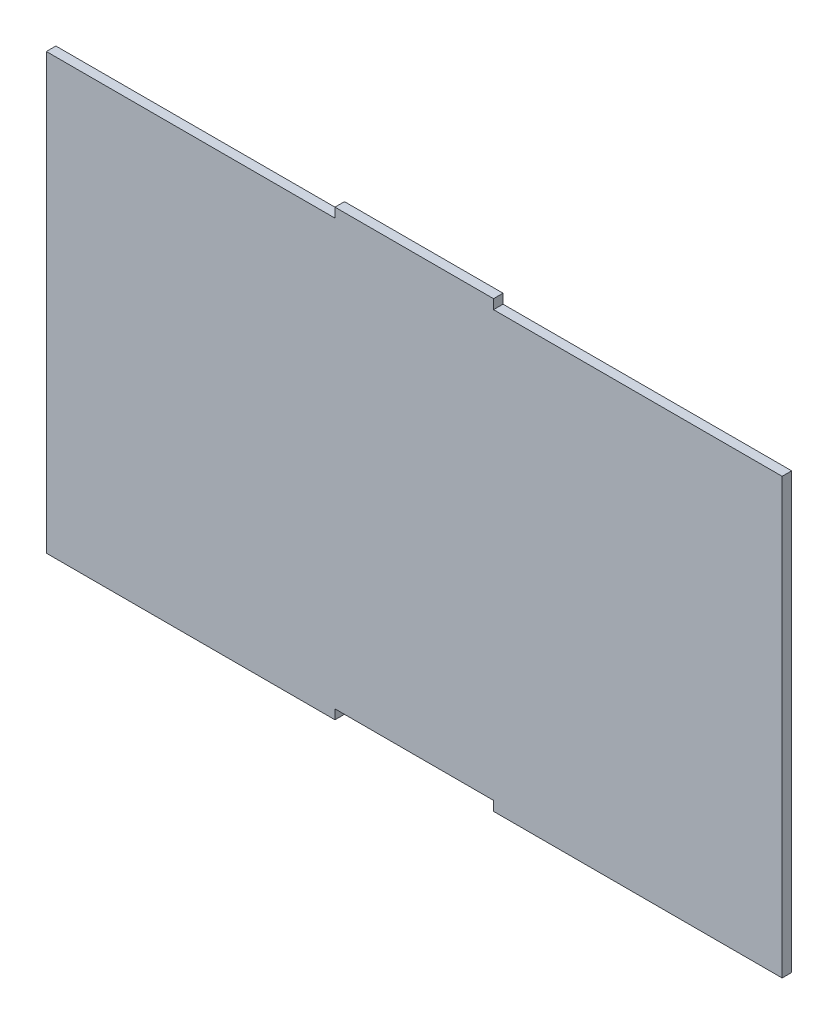
ISO-10303-21;
HEADER;
FILE_DESCRIPTION(('STEP AP214'),'2;1');
FILE_NAME('part.step','',(''),(''),'','','');
FILE_SCHEMA(('AUTOMOTIVE_DESIGN { 1 0 10303 214 1 1 1 1 }'));
ENDSEC;
DATA;
#1=APPLICATION_CONTEXT('core data for automotive mechanical design processes');
#2=APPLICATION_PROTOCOL_DEFINITION('international standard','automotive_design',2000,#1);
#3=PRODUCT_CONTEXT('',#1,'mechanical');
#4=PRODUCT('Part','Part','',(#3));
#5=PRODUCT_RELATED_PRODUCT_CATEGORY('part','',(#4));
#6=PRODUCT_DEFINITION_FORMATION('','',#4);
#7=PRODUCT_DEFINITION_CONTEXT('part definition',#1,'design');
#8=PRODUCT_DEFINITION('design','',#6,#7);
#9=PRODUCT_DEFINITION_SHAPE('','',#8);
#10=(LENGTH_UNIT() NAMED_UNIT(*) SI_UNIT(.MILLI.,.METRE.));
#11=(NAMED_UNIT(*) PLANE_ANGLE_UNIT() SI_UNIT($,.RADIAN.));
#12=(NAMED_UNIT(*) SI_UNIT($,.STERADIAN.) SOLID_ANGLE_UNIT());
#13=UNCERTAINTY_MEASURE_WITH_UNIT(LENGTH_MEASURE(1.E-05),#10,'distance_accuracy_value','');
#14=(GEOMETRIC_REPRESENTATION_CONTEXT(3) GLOBAL_UNCERTAINTY_ASSIGNED_CONTEXT((#13)) GLOBAL_UNIT_ASSIGNED_CONTEXT((#10,
#11,#12)) REPRESENTATION_CONTEXT('',''));
#15=CARTESIAN_POINT('',(0.,0.,0.));
#16=DIRECTION('',(0.,0.,1.));
#17=DIRECTION('',(1.,0.,0.));
#18=AXIS2_PLACEMENT_3D('',#15,#16,#17);
#19=CARTESIAN_POINT('',(91.,0.,3.));
#20=DIRECTION('',(0.,1.,0.));
#21=DIRECTION('',(-1.,0.,0.));
#22=AXIS2_PLACEMENT_3D('',#19,#20,#21);
#23=PLANE('',#22);
#24=DIRECTION('',(1.,0.,0.));
#25=VECTOR('',#24,1.);
#26=CARTESIAN_POINT('',(91.,0.,0.));
#27=LINE('',#26,#25);
#28=CARTESIAN_POINT('',(0.,0.,0.));
#29=VERTEX_POINT('',#28);
#30=CARTESIAN_POINT('',(91.,0.,0.));
#31=VERTEX_POINT('',#30);
#32=EDGE_CURVE('E153',#29,#31,#27,.T.);
#33=ORIENTED_EDGE('',*,*,#32,.T.);
#34=DIRECTION('',(0.,0.,-1.));
#35=VECTOR('',#34,1.);
#36=CARTESIAN_POINT('',(91.,0.,3.));
#37=LINE('',#36,#35);
#38=CARTESIAN_POINT('',(91.,0.,3.));
#39=VERTEX_POINT('',#38);
#40=EDGE_CURVE('E11',#39,#31,#37,.T.);
#41=ORIENTED_EDGE('',*,*,#40,.F.);
#42=DIRECTION('',(1.,0.,0.));
#43=VECTOR('',#42,1.);
#44=CARTESIAN_POINT('',(91.,0.,3.));
#45=LINE('',#44,#43);
#46=CARTESIAN_POINT('',(0.,0.,3.));
#47=VERTEX_POINT('',#46);
#48=EDGE_CURVE('E175',#47,#39,#45,.T.);
#49=ORIENTED_EDGE('',*,*,#48,.F.);
#50=DIRECTION('',(0.,0.,-1.));
#51=VECTOR('',#50,1.);
#52=CARTESIAN_POINT('',(0.,0.,3.));
#53=LINE('',#52,#51);
#54=EDGE_CURVE('E149',#47,#29,#53,.T.);
#55=ORIENTED_EDGE('',*,*,#54,.T.);
#56=EDGE_LOOP('',(#33,#41,#49,#55));
#57=FACE_BOUND('',#56,.T.);
#58=ADVANCED_FACE('F33',(#57),#23,.F.);
#59=CARTESIAN_POINT('',(91.,3.,3.));
#60=DIRECTION('',(-1.,0.,0.));
#61=DIRECTION('',(0.,0.,1.));
#62=AXIS2_PLACEMENT_3D('',#59,#60,#61);
#63=PLANE('',#62);
#64=DIRECTION('',(0.,1.,0.));
#65=VECTOR('',#64,1.);
#66=CARTESIAN_POINT('',(91.,3.,0.));
#67=LINE('',#66,#65);
#68=CARTESIAN_POINT('',(91.,3.,0.));
#69=VERTEX_POINT('',#68);
#70=EDGE_CURVE('E156',#31,#69,#67,.T.);
#71=ORIENTED_EDGE('',*,*,#70,.T.);
#72=DIRECTION('',(0.,0.,-1.));
#73=VECTOR('',#72,1.);
#74=CARTESIAN_POINT('',(91.,3.,3.));
#75=LINE('',#74,#73);
#76=CARTESIAN_POINT('',(91.,3.,3.));
#77=VERTEX_POINT('',#76);
#78=EDGE_CURVE('E41',#77,#69,#75,.T.);
#79=ORIENTED_EDGE('',*,*,#78,.F.);
#80=DIRECTION('',(0.,1.,0.));
#81=VECTOR('',#80,1.);
#82=CARTESIAN_POINT('',(91.,3.,3.));
#83=LINE('',#82,#81);
#84=EDGE_CURVE('E104',#39,#77,#83,.T.);
#85=ORIENTED_EDGE('',*,*,#84,.F.);
#86=ORIENTED_EDGE('',*,*,#40,.T.);
#87=EDGE_LOOP('',(#71,#79,#85,#86));
#88=FACE_BOUND('',#87,.T.);
#89=ADVANCED_FACE('F253',(#88),#63,.F.);
#90=CARTESIAN_POINT('',(141.,3.00000000000001,3.));
#91=DIRECTION('',(0.,1.,0.));
#92=DIRECTION('',(-1.,0.,0.));
#93=AXIS2_PLACEMENT_3D('',#90,#91,#92);
#94=PLANE('',#93);
#95=DIRECTION('',(1.,0.,0.));
#96=VECTOR('',#95,1.);
#97=CARTESIAN_POINT('',(141.,3.00000000000001,0.));
#98=LINE('',#97,#96);
#99=CARTESIAN_POINT('',(141.,3.00000000000001,0.));
#100=VERTEX_POINT('',#99);
#101=EDGE_CURVE('E158',#69,#100,#98,.T.);
#102=ORIENTED_EDGE('',*,*,#101,.T.);
#103=DIRECTION('',(0.,0.,-1.));
#104=VECTOR('',#103,1.);
#105=CARTESIAN_POINT('',(141.,3.00000000000001,3.));
#106=LINE('',#105,#104);
#107=CARTESIAN_POINT('',(141.,3.00000000000001,3.));
#108=VERTEX_POINT('',#107);
#109=EDGE_CURVE('E194',#108,#100,#106,.T.);
#110=ORIENTED_EDGE('',*,*,#109,.F.);
#111=DIRECTION('',(1.,0.,0.));
#112=VECTOR('',#111,1.);
#113=CARTESIAN_POINT('',(141.,3.00000000000001,3.));
#114=LINE('',#113,#112);
#115=EDGE_CURVE('E202',#77,#108,#114,.T.);
#116=ORIENTED_EDGE('',*,*,#115,.F.);
#117=ORIENTED_EDGE('',*,*,#78,.T.);
#118=EDGE_LOOP('',(#102,#110,#116,#117));
#119=FACE_BOUND('',#118,.T.);
#120=ADVANCED_FACE('F200',(#119),#94,.F.);
#121=CARTESIAN_POINT('',(141.,0.,3.));
#122=DIRECTION('',(1.,0.,0.));
#123=DIRECTION('',(0.,0.,-1.));
#124=AXIS2_PLACEMENT_3D('',#121,#122,#123);
#125=PLANE('',#124);
#126=DIRECTION('',(0.,-1.,0.));
#127=VECTOR('',#126,1.);
#128=CARTESIAN_POINT('',(141.,0.,0.));
#129=LINE('',#128,#127);
#130=CARTESIAN_POINT('',(141.,0.,0.));
#131=VERTEX_POINT('',#130);
#132=EDGE_CURVE('E160',#100,#131,#129,.T.);
#133=ORIENTED_EDGE('',*,*,#132,.T.);
#134=DIRECTION('',(0.,0.,-1.));
#135=VECTOR('',#134,1.);
#136=CARTESIAN_POINT('',(141.,0.,3.));
#137=LINE('',#136,#135);
#138=CARTESIAN_POINT('',(141.,0.,3.));
#139=VERTEX_POINT('',#138);
#140=EDGE_CURVE('E191',#139,#131,#137,.T.);
#141=ORIENTED_EDGE('',*,*,#140,.F.);
#142=DIRECTION('',(0.,-1.,0.));
#143=VECTOR('',#142,1.);
#144=CARTESIAN_POINT('',(141.,0.,3.));
#145=LINE('',#144,#143);
#146=EDGE_CURVE('E220',#108,#139,#145,.T.);
#147=ORIENTED_EDGE('',*,*,#146,.F.);
#148=ORIENTED_EDGE('',*,*,#109,.T.);
#149=EDGE_LOOP('',(#133,#141,#147,#148));
#150=FACE_BOUND('',#149,.T.);
#151=ADVANCED_FACE('F211',(#150),#125,.F.);
#152=CARTESIAN_POINT('',(232.,0.,3.));
#153=DIRECTION('',(0.,1.,0.));
#154=DIRECTION('',(-1.,0.,0.));
#155=AXIS2_PLACEMENT_3D('',#152,#153,#154);
#156=PLANE('',#155);
#157=DIRECTION('',(1.,0.,0.));
#158=VECTOR('',#157,1.);
#159=CARTESIAN_POINT('',(232.,0.,0.));
#160=LINE('',#159,#158);
#161=CARTESIAN_POINT('',(232.,0.,0.));
#162=VERTEX_POINT('',#161);
#163=EDGE_CURVE('E162',#131,#162,#160,.T.);
#164=ORIENTED_EDGE('',*,*,#163,.T.);
#165=DIRECTION('',(0.,0.,-1.));
#166=VECTOR('',#165,1.);
#167=CARTESIAN_POINT('',(232.,0.,3.));
#168=LINE('',#167,#166);
#169=CARTESIAN_POINT('',(232.,0.,3.));
#170=VERTEX_POINT('',#169);
#171=EDGE_CURVE('E188',#170,#162,#168,.T.);
#172=ORIENTED_EDGE('',*,*,#171,.F.);
#173=DIRECTION('',(1.,0.,0.));
#174=VECTOR('',#173,1.);
#175=CARTESIAN_POINT('',(232.,0.,3.));
#176=LINE('',#175,#174);
#177=EDGE_CURVE('E217',#139,#170,#176,.T.);
#178=ORIENTED_EDGE('',*,*,#177,.F.);
#179=ORIENTED_EDGE('',*,*,#140,.T.);
#180=EDGE_LOOP('',(#164,#172,#178,#179));
#181=FACE_BOUND('',#180,.T.);
#182=ADVANCED_FACE('F215',(#181),#156,.F.);
#183=CARTESIAN_POINT('',(232.,137.,3.));
#184=DIRECTION('',(-1.,0.,0.));
#185=DIRECTION('',(0.,0.,1.));
#186=AXIS2_PLACEMENT_3D('',#183,#184,#185);
#187=PLANE('',#186);
#188=DIRECTION('',(0.,1.,0.));
#189=VECTOR('',#188,1.);
#190=CARTESIAN_POINT('',(232.,137.,0.));
#191=LINE('',#190,#189);
#192=CARTESIAN_POINT('',(232.,137.,0.));
#193=VERTEX_POINT('',#192);
#194=EDGE_CURVE('E164',#162,#193,#191,.T.);
#195=ORIENTED_EDGE('',*,*,#194,.T.);
#196=DIRECTION('',(0.,0.,-1.));
#197=VECTOR('',#196,1.);
#198=CARTESIAN_POINT('',(232.,137.,3.));
#199=LINE('',#198,#197);
#200=CARTESIAN_POINT('',(232.,137.,3.));
#201=VERTEX_POINT('',#200);
#202=EDGE_CURVE('E185',#201,#193,#199,.T.);
#203=ORIENTED_EDGE('',*,*,#202,.F.);
#204=DIRECTION('',(0.,1.,0.));
#205=VECTOR('',#204,1.);
#206=CARTESIAN_POINT('',(232.,137.,3.));
#207=LINE('',#206,#205);
#208=EDGE_CURVE('E219',#170,#201,#207,.T.);
#209=ORIENTED_EDGE('',*,*,#208,.F.);
#210=ORIENTED_EDGE('',*,*,#171,.T.);
#211=EDGE_LOOP('',(#195,#203,#209,#210));
#212=FACE_BOUND('',#211,.T.);
#213=ADVANCED_FACE('F266',(#212),#187,.F.);
#214=CARTESIAN_POINT('',(141.,137.,3.));
#215=DIRECTION('',(0.,-1.,0.));
#216=DIRECTION('',(0.,0.,-1.));
#217=AXIS2_PLACEMENT_3D('',#214,#215,#216);
#218=PLANE('',#217);
#219=DIRECTION('',(-1.,0.,0.));
#220=VECTOR('',#219,1.);
#221=CARTESIAN_POINT('',(141.,137.,0.));
#222=LINE('',#221,#220);
#223=CARTESIAN_POINT('',(141.,137.,0.));
#224=VERTEX_POINT('',#223);
#225=EDGE_CURVE('E166',#193,#224,#222,.T.);
#226=ORIENTED_EDGE('',*,*,#225,.T.);
#227=DIRECTION('',(0.,0.,-1.));
#228=VECTOR('',#227,1.);
#229=CARTESIAN_POINT('',(141.,137.,3.));
#230=LINE('',#229,#228);
#231=CARTESIAN_POINT('',(141.,137.,3.));
#232=VERTEX_POINT('',#231);
#233=EDGE_CURVE('E182',#232,#224,#230,.T.);
#234=ORIENTED_EDGE('',*,*,#233,.F.);
#235=DIRECTION('',(-1.,0.,0.));
#236=VECTOR('',#235,1.);
#237=CARTESIAN_POINT('',(141.,137.,3.));
#238=LINE('',#237,#236);
#239=EDGE_CURVE('E222',#201,#232,#238,.T.);
#240=ORIENTED_EDGE('',*,*,#239,.F.);
#241=ORIENTED_EDGE('',*,*,#202,.T.);
#242=EDGE_LOOP('',(#226,#234,#240,#241));
#243=FACE_BOUND('',#242,.T.);
#244=ADVANCED_FACE('F269',(#243),#218,.F.);
#245=CARTESIAN_POINT('',(141.,140.,3.));
#246=DIRECTION('',(-1.,0.,0.));
#247=DIRECTION('',(0.,0.,1.));
#248=AXIS2_PLACEMENT_3D('',#245,#246,#247);
#249=PLANE('',#248);
#250=DIRECTION('',(0.,1.,0.));
#251=VECTOR('',#250,1.);
#252=CARTESIAN_POINT('',(141.,140.,0.));
#253=LINE('',#252,#251);
#254=CARTESIAN_POINT('',(141.,140.,0.));
#255=VERTEX_POINT('',#254);
#256=EDGE_CURVE('E168',#224,#255,#253,.T.);
#257=ORIENTED_EDGE('',*,*,#256,.T.);
#258=DIRECTION('',(0.,0.,-1.));
#259=VECTOR('',#258,1.);
#260=CARTESIAN_POINT('',(141.,140.,3.));
#261=LINE('',#260,#259);
#262=CARTESIAN_POINT('',(141.,140.,3.));
#263=VERTEX_POINT('',#262);
#264=EDGE_CURVE('E179',#263,#255,#261,.T.);
#265=ORIENTED_EDGE('',*,*,#264,.F.);
#266=DIRECTION('',(0.,1.,0.));
#267=VECTOR('',#266,1.);
#268=CARTESIAN_POINT('',(141.,140.,3.));
#269=LINE('',#268,#267);
#270=EDGE_CURVE('E228',#232,#263,#269,.T.);
#271=ORIENTED_EDGE('',*,*,#270,.F.);
#272=ORIENTED_EDGE('',*,*,#233,.T.);
#273=EDGE_LOOP('',(#257,#265,#271,#272));
#274=FACE_BOUND('',#273,.T.);
#275=ADVANCED_FACE('F234',(#274),#249,.F.);
#276=CARTESIAN_POINT('',(91.,140.,3.));
#277=DIRECTION('',(0.,-1.,0.));
#278=DIRECTION('',(0.,0.,-1.));
#279=AXIS2_PLACEMENT_3D('',#276,#277,#278);
#280=PLANE('',#279);
#281=DIRECTION('',(-1.,0.,0.));
#282=VECTOR('',#281,1.);
#283=CARTESIAN_POINT('',(91.,140.,0.));
#284=LINE('',#283,#282);
#285=CARTESIAN_POINT('',(91.,140.,0.));
#286=VERTEX_POINT('',#285);
#287=EDGE_CURVE('E170',#255,#286,#284,.T.);
#288=ORIENTED_EDGE('',*,*,#287,.T.);
#289=DIRECTION('',(0.,0.,-1.));
#290=VECTOR('',#289,1.);
#291=CARTESIAN_POINT('',(91.,140.,3.));
#292=LINE('',#291,#290);
#293=CARTESIAN_POINT('',(91.,140.,3.));
#294=VERTEX_POINT('',#293);
#295=EDGE_CURVE('E144',#294,#286,#292,.T.);
#296=ORIENTED_EDGE('',*,*,#295,.F.);
#297=DIRECTION('',(-1.,0.,0.));
#298=VECTOR('',#297,1.);
#299=CARTESIAN_POINT('',(91.,140.,3.));
#300=LINE('',#299,#298);
#301=EDGE_CURVE('E135',#263,#294,#300,.T.);
#302=ORIENTED_EDGE('',*,*,#301,.F.);
#303=ORIENTED_EDGE('',*,*,#264,.T.);
#304=EDGE_LOOP('',(#288,#296,#302,#303));
#305=FACE_BOUND('',#304,.T.);
#306=ADVANCED_FACE('F238',(#305),#280,.F.);
#307=CARTESIAN_POINT('',(91.,137.,3.));
#308=DIRECTION('',(1.,0.,0.));
#309=DIRECTION('',(0.,0.,-1.));
#310=AXIS2_PLACEMENT_3D('',#307,#308,#309);
#311=PLANE('',#310);
#312=DIRECTION('',(0.,-1.,0.));
#313=VECTOR('',#312,1.);
#314=CARTESIAN_POINT('',(91.,137.,0.));
#315=LINE('',#314,#313);
#316=CARTESIAN_POINT('',(91.,137.,0.));
#317=VERTEX_POINT('',#316);
#318=EDGE_CURVE('E143',#286,#317,#315,.T.);
#319=ORIENTED_EDGE('',*,*,#318,.T.);
#320=DIRECTION('',(0.,0.,-1.));
#321=VECTOR('',#320,1.);
#322=CARTESIAN_POINT('',(91.,137.,3.));
#323=LINE('',#322,#321);
#324=CARTESIAN_POINT('',(91.,137.,3.));
#325=VERTEX_POINT('',#324);
#326=EDGE_CURVE('E140',#325,#317,#323,.T.);
#327=ORIENTED_EDGE('',*,*,#326,.F.);
#328=DIRECTION('',(0.,-1.,0.));
#329=VECTOR('',#328,1.);
#330=CARTESIAN_POINT('',(91.,137.,3.));
#331=LINE('',#330,#329);
#332=EDGE_CURVE('E129',#294,#325,#331,.T.);
#333=ORIENTED_EDGE('',*,*,#332,.F.);
#334=ORIENTED_EDGE('',*,*,#295,.T.);
#335=EDGE_LOOP('',(#319,#327,#333,#334));
#336=FACE_BOUND('',#335,.T.);
#337=ADVANCED_FACE('F141',(#336),#311,.F.);
#338=CARTESIAN_POINT('',(0.,137.,3.));
#339=DIRECTION('',(0.,-1.,0.));
#340=DIRECTION('',(1.,0.,0.));
#341=AXIS2_PLACEMENT_3D('',#338,#339,#340);
#342=PLANE('',#341);
#343=DIRECTION('',(-1.,0.,0.));
#344=VECTOR('',#343,1.);
#345=CARTESIAN_POINT('',(0.,137.,0.));
#346=LINE('',#345,#344);
#347=CARTESIAN_POINT('',(0.,137.,0.));
#348=VERTEX_POINT('',#347);
#349=EDGE_CURVE('E90',#317,#348,#346,.T.);
#350=ORIENTED_EDGE('',*,*,#349,.T.);
#351=DIRECTION('',(0.,0.,-1.));
#352=VECTOR('',#351,1.);
#353=CARTESIAN_POINT('',(0.,137.,3.));
#354=LINE('',#353,#352);
#355=CARTESIAN_POINT('',(0.,137.,3.));
#356=VERTEX_POINT('',#355);
#357=EDGE_CURVE('E145',#356,#348,#354,.T.);
#358=ORIENTED_EDGE('',*,*,#357,.F.);
#359=DIRECTION('',(-1.,0.,0.));
#360=VECTOR('',#359,1.);
#361=CARTESIAN_POINT('',(0.,137.,3.));
#362=LINE('',#361,#360);
#363=EDGE_CURVE('E133',#325,#356,#362,.T.);
#364=ORIENTED_EDGE('',*,*,#363,.F.);
#365=ORIENTED_EDGE('',*,*,#326,.T.);
#366=EDGE_LOOP('',(#350,#358,#364,#365));
#367=FACE_BOUND('',#366,.T.);
#368=ADVANCED_FACE('F147',(#367),#342,.F.);
#369=CARTESIAN_POINT('',(0.,0.,3.));
#370=DIRECTION('',(1.,0.,0.));
#371=DIRECTION('',(0.,1.,0.));
#372=AXIS2_PLACEMENT_3D('',#369,#370,#371);
#373=PLANE('',#372);
#374=DIRECTION('',(0.,-1.,0.));
#375=VECTOR('',#374,1.);
#376=CARTESIAN_POINT('',(0.,0.,0.));
#377=LINE('',#376,#375);
#378=EDGE_CURVE('E96',#348,#29,#377,.T.);
#379=ORIENTED_EDGE('',*,*,#378,.T.);
#380=ORIENTED_EDGE('',*,*,#54,.F.);
#381=DIRECTION('',(0.,-1.,0.));
#382=VECTOR('',#381,1.);
#383=CARTESIAN_POINT('',(0.,0.,3.));
#384=LINE('',#383,#382);
#385=EDGE_CURVE('E49',#356,#47,#384,.T.);
#386=ORIENTED_EDGE('',*,*,#385,.F.);
#387=ORIENTED_EDGE('',*,*,#357,.T.);
#388=EDGE_LOOP('',(#379,#380,#386,#387));
#389=FACE_BOUND('',#388,.T.);
#390=ADVANCED_FACE('F242',(#389),#373,.F.);
#391=CARTESIAN_POINT('',(0.,0.,3.));
#392=DIRECTION('',(0.,0.,-1.));
#393=DIRECTION('',(-1.,0.,0.));
#394=AXIS2_PLACEMENT_3D('',#391,#392,#393);
#395=PLANE('',#394);
#396=ORIENTED_EDGE('',*,*,#48,.T.);
#397=ORIENTED_EDGE('',*,*,#84,.T.);
#398=ORIENTED_EDGE('',*,*,#115,.T.);
#399=ORIENTED_EDGE('',*,*,#146,.T.);
#400=ORIENTED_EDGE('',*,*,#177,.T.);
#401=ORIENTED_EDGE('',*,*,#208,.T.);
#402=ORIENTED_EDGE('',*,*,#239,.T.);
#403=ORIENTED_EDGE('',*,*,#270,.T.);
#404=ORIENTED_EDGE('',*,*,#301,.T.);
#405=ORIENTED_EDGE('',*,*,#332,.T.);
#406=ORIENTED_EDGE('',*,*,#363,.T.);
#407=ORIENTED_EDGE('',*,*,#385,.T.);
#408=EDGE_LOOP('',(#396,#397,#398,#399,#400,#401,#402,#403,#404,#405,#406,#407));
#409=FACE_BOUND('',#408,.T.);
#410=ADVANCED_FACE('F131',(#409),#395,.F.);
#411=CARTESIAN_POINT('',(0.,0.,0.));
#412=DIRECTION('',(0.,0.,-1.));
#413=DIRECTION('',(-1.,0.,0.));
#414=AXIS2_PLACEMENT_3D('',#411,#412,#413);
#415=PLANE('',#414);
#416=ORIENTED_EDGE('',*,*,#32,.F.);
#417=ORIENTED_EDGE('',*,*,#378,.F.);
#418=ORIENTED_EDGE('',*,*,#349,.F.);
#419=ORIENTED_EDGE('',*,*,#318,.F.);
#420=ORIENTED_EDGE('',*,*,#287,.F.);
#421=ORIENTED_EDGE('',*,*,#256,.F.);
#422=ORIENTED_EDGE('',*,*,#225,.F.);
#423=ORIENTED_EDGE('',*,*,#194,.F.);
#424=ORIENTED_EDGE('',*,*,#163,.F.);
#425=ORIENTED_EDGE('',*,*,#132,.F.);
#426=ORIENTED_EDGE('',*,*,#101,.F.);
#427=ORIENTED_EDGE('',*,*,#70,.F.);
#428=EDGE_LOOP('',(#416,#417,#418,#419,#420,#421,#422,#423,#424,#425,#426,#427));
#429=FACE_BOUND('',#428,.T.);
#430=ADVANCED_FACE('F206',(#429),#415,.T.);
#431=CLOSED_SHELL('',(#58,#89,#120,#151,#182,#213,#244,#275,#306,#337,#368,#390,#410,#430));
#432=MANIFOLD_SOLID_BREP('B2',#431);
#433=ADVANCED_BREP_SHAPE_REPRESENTATION('',(#18,#432),#14);
#434=SHAPE_DEFINITION_REPRESENTATION(#9,#433);
ENDSEC;
END-ISO-10303-21;
